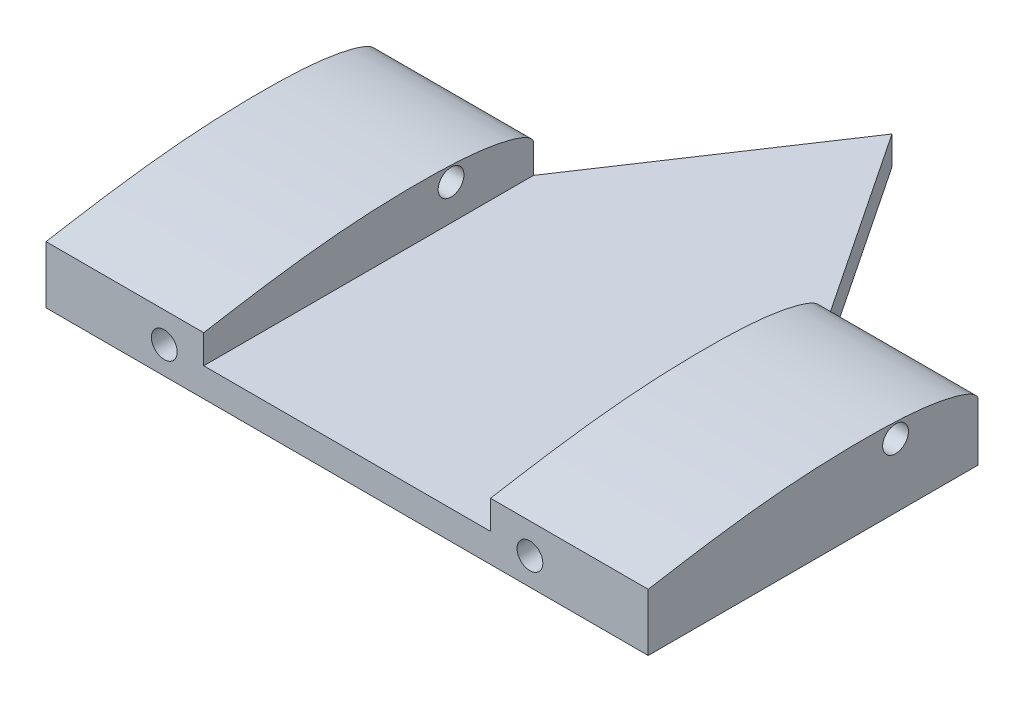
ISO-10303-21;
HEADER;
FILE_DESCRIPTION(('STEP AP214'),'2;1');
FILE_NAME('part.step','',(''),(''),'','','');
FILE_SCHEMA(('AUTOMOTIVE_DESIGN { 1 0 10303 214 1 1 1 1 }'));
ENDSEC;
DATA;
#1=APPLICATION_CONTEXT('core data for automotive mechanical design processes');
#2=APPLICATION_PROTOCOL_DEFINITION('international standard','automotive_design',2000,#1);
#3=PRODUCT_CONTEXT('',#1,'mechanical');
#4=PRODUCT('Part','Part','',(#3));
#5=PRODUCT_RELATED_PRODUCT_CATEGORY('part','',(#4));
#6=PRODUCT_DEFINITION_FORMATION('','',#4);
#7=PRODUCT_DEFINITION_CONTEXT('part definition',#1,'design');
#8=PRODUCT_DEFINITION('design','',#6,#7);
#9=PRODUCT_DEFINITION_SHAPE('','',#8);
#10=(LENGTH_UNIT() NAMED_UNIT(*) SI_UNIT(.MILLI.,.METRE.));
#11=(NAMED_UNIT(*) PLANE_ANGLE_UNIT() SI_UNIT($,.RADIAN.));
#12=(NAMED_UNIT(*) SI_UNIT($,.STERADIAN.) SOLID_ANGLE_UNIT());
#13=UNCERTAINTY_MEASURE_WITH_UNIT(LENGTH_MEASURE(1.E-05),#10,'distance_accuracy_value','');
#14=(GEOMETRIC_REPRESENTATION_CONTEXT(3) GLOBAL_UNCERTAINTY_ASSIGNED_CONTEXT((#13)) GLOBAL_UNIT_ASSIGNED_CONTEXT((#10,
#11,#12)) REPRESENTATION_CONTEXT('',''));
#15=CARTESIAN_POINT('',(0.,0.,0.));
#16=DIRECTION('',(0.,0.,1.));
#17=DIRECTION('',(1.,0.,0.));
#18=AXIS2_PLACEMENT_3D('',#15,#16,#17);
#19=CARTESIAN_POINT('',(0.,10.,-265.));
#20=DIRECTION('',(-0.832050294337844,0.,0.554700196225229));
#21=DIRECTION('',(0.554700196225229,0.,0.832050294337844));
#22=AXIS2_PLACEMENT_3D('',#19,#20,#21);
#23=PLANE('',#22);
#24=DIRECTION('',(0.,-1.,0.));
#25=VECTOR('',#24,1.);
#26=CARTESIAN_POINT('',(100.,10.,-115.));
#27=LINE('',#26,#25);
#28=CARTESIAN_POINT('',(100.,10.,-115.));
#29=VERTEX_POINT('',#28);
#30=CARTESIAN_POINT('',(100.,-10.,-115.));
#31=VERTEX_POINT('',#30);
#32=EDGE_CURVE('E11',#29,#31,#27,.T.);
#33=ORIENTED_EDGE('',*,*,#32,.T.);
#34=DIRECTION('',(0.554700196225229,0.,0.832050294337843));
#35=VECTOR('',#34,1.);
#36=CARTESIAN_POINT('',(100.,-10.,-115.));
#37=LINE('',#36,#35);
#38=CARTESIAN_POINT('',(0.,-10.,-265.));
#39=VERTEX_POINT('',#38);
#40=EDGE_CURVE('E150',#39,#31,#37,.T.);
#41=ORIENTED_EDGE('',*,*,#40,.F.);
#42=DIRECTION('',(0.,-1.,0.));
#43=VECTOR('',#42,1.);
#44=CARTESIAN_POINT('',(0.,10.,-265.));
#45=LINE('',#44,#43);
#46=CARTESIAN_POINT('',(0.,10.,-265.));
#47=VERTEX_POINT('',#46);
#48=EDGE_CURVE('E43',#47,#39,#45,.T.);
#49=ORIENTED_EDGE('',*,*,#48,.F.);
#50=DIRECTION('',(-0.554700196225229,0.,-0.832050294337844));
#51=VECTOR('',#50,1.);
#52=CARTESIAN_POINT('',(0.,10.,-265.));
#53=LINE('',#52,#51);
#54=EDGE_CURVE('E58',#29,#47,#53,.T.);
#55=ORIENTED_EDGE('',*,*,#54,.F.);
#56=EDGE_LOOP('',(#33,#41,#49,#55));
#57=FACE_BOUND('',#56,.T.);
#58=ADVANCED_FACE('F36',(#57),#23,.F.);
#59=CARTESIAN_POINT('',(-100.,10.,-115.));
#60=DIRECTION('',(0.832050294337844,0.,0.554700196225229));
#61=DIRECTION('',(0.554700196225229,0.,-0.832050294337844));
#62=AXIS2_PLACEMENT_3D('',#59,#60,#61);
#63=PLANE('',#62);
#64=ORIENTED_EDGE('',*,*,#48,.T.);
#65=DIRECTION('',(0.55470019622523,0.,-0.832050294337843));
#66=VECTOR('',#65,1.);
#67=CARTESIAN_POINT('',(0.,-10.,-265.));
#68=LINE('',#67,#66);
#69=CARTESIAN_POINT('',(-100.,-10.,-115.));
#70=VERTEX_POINT('',#69);
#71=EDGE_CURVE('E135',#70,#39,#68,.T.);
#72=ORIENTED_EDGE('',*,*,#71,.F.);
#73=DIRECTION('',(0.,-1.,0.));
#74=VECTOR('',#73,1.);
#75=CARTESIAN_POINT('',(-100.,10.,-115.));
#76=LINE('',#75,#74);
#77=CARTESIAN_POINT('',(-100.,10.,-115.));
#78=VERTEX_POINT('',#77);
#79=EDGE_CURVE('E131',#78,#70,#76,.T.);
#80=ORIENTED_EDGE('',*,*,#79,.F.);
#81=DIRECTION('',(-0.554700196225229,0.,0.832050294337844));
#82=VECTOR('',#81,1.);
#83=CARTESIAN_POINT('',(-100.,10.,-115.));
#84=LINE('',#83,#82);
#85=EDGE_CURVE('E239',#47,#78,#84,.T.);
#86=ORIENTED_EDGE('',*,*,#85,.F.);
#87=EDGE_LOOP('',(#64,#72,#80,#86));
#88=FACE_BOUND('',#87,.T.);
#89=ADVANCED_FACE('F248',(#88),#63,.F.);
#90=CARTESIAN_POINT('',(-100.,10.,115.));
#91=DIRECTION('',(0.,0.,-1.));
#92=DIRECTION('',(-1.,0.,0.));
#93=AXIS2_PLACEMENT_3D('',#90,#91,#92);
#94=PLANE('',#93);
#95=CARTESIAN_POINT('',(127.5,9.,115.));
#96=DIRECTION('',(0.,0.,-1.));
#97=DIRECTION('',(-1.,0.,0.));
#98=AXIS2_PLACEMENT_3D('',#95,#96,#97);
#99=CIRCLE('',#98,9.00000000000001);
#100=CARTESIAN_POINT('',(118.5,9.,115.));
#101=VERTEX_POINT('',#100);
#102=EDGE_CURVE('E294',#101,#101,#99,.T.);
#103=ORIENTED_EDGE('',*,*,#102,.T.);
#104=EDGE_LOOP('',(#103));
#105=FACE_BOUND('',#104,.T.);
#106=CARTESIAN_POINT('',(-127.5,9.,115.));
#107=DIRECTION('',(0.,0.,1.));
#108=DIRECTION('',(1.,0.,0.));
#109=AXIS2_PLACEMENT_3D('',#106,#107,#108);
#110=CIRCLE('',#109,9.00000000000001);
#111=CARTESIAN_POINT('',(-118.5,9.,115.));
#112=VERTEX_POINT('',#111);
#113=EDGE_CURVE('E145',#112,#112,#110,.T.);
#114=ORIENTED_EDGE('',*,*,#113,.F.);
#115=EDGE_LOOP('',(#114));
#116=FACE_BOUND('',#115,.T.);
#117=DIRECTION('',(0.,-1.,0.));
#118=VECTOR('',#117,1.);
#119=CARTESIAN_POINT('',(-210.,30.,115.));
#120=LINE('',#119,#118);
#121=CARTESIAN_POINT('',(-210.,30.,115.));
#122=VERTEX_POINT('',#121);
#123=CARTESIAN_POINT('',(-210.,-10.,115.));
#124=VERTEX_POINT('',#123);
#125=EDGE_CURVE('E124',#122,#124,#120,.T.);
#126=ORIENTED_EDGE('',*,*,#125,.T.);
#127=DIRECTION('',(-1.,0.,0.));
#128=VECTOR('',#127,1.);
#129=CARTESIAN_POINT('',(-210.,-10.,115.));
#130=LINE('',#129,#128);
#131=CARTESIAN_POINT('',(210.,-10.,115.));
#132=VERTEX_POINT('',#131);
#133=EDGE_CURVE('E141',#132,#124,#130,.T.);
#134=ORIENTED_EDGE('',*,*,#133,.F.);
#135=DIRECTION('',(0.,-1.,0.));
#136=VECTOR('',#135,1.);
#137=CARTESIAN_POINT('',(210.,30.,115.));
#138=LINE('',#137,#136);
#139=CARTESIAN_POINT('',(210.,30.,115.));
#140=VERTEX_POINT('',#139);
#141=EDGE_CURVE('E223',#140,#132,#138,.T.);
#142=ORIENTED_EDGE('',*,*,#141,.F.);
#143=DIRECTION('',(-1.,0.,0.));
#144=VECTOR('',#143,1.);
#145=CARTESIAN_POINT('',(100.,30.,115.));
#146=LINE('',#145,#144);
#147=CARTESIAN_POINT('',(100.,30.,115.));
#148=VERTEX_POINT('',#147);
#149=EDGE_CURVE('E203',#140,#148,#146,.T.);
#150=ORIENTED_EDGE('',*,*,#149,.T.);
#151=DIRECTION('',(0.,-1.,0.));
#152=VECTOR('',#151,1.);
#153=CARTESIAN_POINT('',(100.,30.,115.));
#154=LINE('',#153,#152);
#155=CARTESIAN_POINT('',(100.,10.,115.));
#156=VERTEX_POINT('',#155);
#157=EDGE_CURVE('E225',#148,#156,#154,.T.);
#158=ORIENTED_EDGE('',*,*,#157,.T.);
#159=DIRECTION('',(1.,0.,0.));
#160=VECTOR('',#159,1.);
#161=CARTESIAN_POINT('',(-100.,10.,115.));
#162=LINE('',#161,#160);
#163=CARTESIAN_POINT('',(-100.,10.,115.));
#164=VERTEX_POINT('',#163);
#165=EDGE_CURVE('E243',#164,#156,#162,.T.);
#166=ORIENTED_EDGE('',*,*,#165,.F.);
#167=DIRECTION('',(0.,-1.,0.));
#168=VECTOR('',#167,1.);
#169=CARTESIAN_POINT('',(-100.,30.,115.));
#170=LINE('',#169,#168);
#171=CARTESIAN_POINT('',(-100.,30.,115.));
#172=VERTEX_POINT('',#171);
#173=EDGE_CURVE('E50',#172,#164,#170,.T.);
#174=ORIENTED_EDGE('',*,*,#173,.F.);
#175=DIRECTION('',(1.,0.,0.));
#176=VECTOR('',#175,1.);
#177=CARTESIAN_POINT('',(-100.,30.,115.));
#178=LINE('',#177,#176);
#179=EDGE_CURVE('E230',#122,#172,#178,.T.);
#180=ORIENTED_EDGE('',*,*,#179,.F.);
#181=EDGE_LOOP('',(#126,#134,#142,#150,#158,#166,#174,#180));
#182=FACE_BOUND('',#181,.T.);
#183=ADVANCED_FACE('F261',(#105,#116,#182),#94,.F.);
#184=CARTESIAN_POINT('',(0.,10.,0.));
#185=DIRECTION('',(0.,1.,0.));
#186=DIRECTION('',(0.,0.,1.));
#187=AXIS2_PLACEMENT_3D('',#184,#185,#186);
#188=PLANE('',#187);
#189=DIRECTION('',(0.,0.,-1.));
#190=VECTOR('',#189,1.);
#191=CARTESIAN_POINT('',(100.,10.,-115.));
#192=LINE('',#191,#190);
#193=EDGE_CURVE('E236',#156,#29,#192,.T.);
#194=ORIENTED_EDGE('',*,*,#193,.T.);
#195=ORIENTED_EDGE('',*,*,#54,.T.);
#196=ORIENTED_EDGE('',*,*,#85,.T.);
#197=DIRECTION('',(0.,0.,1.));
#198=VECTOR('',#197,1.);
#199=CARTESIAN_POINT('',(-100.,10.,-115.));
#200=LINE('',#199,#198);
#201=EDGE_CURVE('E241',#78,#164,#200,.T.);
#202=ORIENTED_EDGE('',*,*,#201,.T.);
#203=ORIENTED_EDGE('',*,*,#165,.T.);
#204=EDGE_LOOP('',(#194,#195,#196,#202,#203));
#205=FACE_BOUND('',#204,.T.);
#206=ADVANCED_FACE('F266',(#205),#188,.T.);
#207=CARTESIAN_POINT('',(-100.,30.,-115.));
#208=DIRECTION('',(-1.,0.,0.));
#209=DIRECTION('',(0.,0.,1.));
#210=AXIS2_PLACEMENT_3D('',#207,#208,#209);
#211=PLANE('',#210);
#212=CARTESIAN_POINT('',(-100.,34.6591642479932,-57.5));
#213=DIRECTION('',(-1.,0.,0.));
#214=DIRECTION('',(0.,0.,1.));
#215=AXIS2_PLACEMENT_3D('',#212,#213,#214);
#216=CIRCLE('',#215,9.);
#217=CARTESIAN_POINT('',(-100.,34.6591642479932,-48.5));
#218=VERTEX_POINT('',#217);
#219=EDGE_CURVE('E168',#218,#218,#216,.T.);
#220=ORIENTED_EDGE('',*,*,#219,.T.);
#221=EDGE_LOOP('',(#220));
#222=FACE_BOUND('',#221,.T.);
#223=DIRECTION('',(0.,-1.,0.));
#224=VECTOR('',#223,1.);
#225=CARTESIAN_POINT('',(-100.,30.,-115.));
#226=LINE('',#225,#224);
#227=CARTESIAN_POINT('',(-100.,30.0000050411301,-114.999999999993));
#228=VERTEX_POINT('',#227);
#229=EDGE_CURVE('E123',#228,#78,#226,.T.);
#230=ORIENTED_EDGE('',*,*,#229,.F.);
#231=CARTESIAN_POINT('',(-100.,30.,115.));
#232=CARTESIAN_POINT('',(-100.,29.992600644719,115.000210544511));
#233=CARTESIAN_POINT('',(-100.,30.1584758641625,113.422148563991));
#234=CARTESIAN_POINT('',(-100.,30.283772029197,111.796644727155));
#235=CARTESIAN_POINT('',(-100.,30.6303383556584,107.814194843398));
#236=CARTESIAN_POINT('',(-100.,30.9873292624649,102.861879622821));
#237=CARTESIAN_POINT('',(-100.,31.376231825754,96.305865405435));
#238=CARTESIAN_POINT('',(-100.,31.6755175866837,88.4893180367523));
#239=CARTESIAN_POINT('',(-100.,31.8077426842266,79.4304945026712));
#240=CARTESIAN_POINT('',(-100.,31.683388701479,69.3413910816794));
#241=CARTESIAN_POINT('',(-100.,31.2745030756222,58.4198501022311));
#242=CARTESIAN_POINT('',(-100.,30.6447969440572,46.8773694769848));
#243=CARTESIAN_POINT('',(-100.,29.8470394342065,34.896947283972));
#244=CARTESIAN_POINT('',(-100.,28.9374050275403,22.6466135348471));
#245=CARTESIAN_POINT('',(-100.,27.9770698966659,10.2824208580842));
#246=CARTESIAN_POINT('',(-100.,27.0298462453761,-2.05398662107581));
#247=CARTESIAN_POINT('',(-100.,26.170492862714,-14.2412429695328));
#248=CARTESIAN_POINT('',(-100.,25.4467077810828,-26.1772298233817));
#249=CARTESIAN_POINT('',(-100.,24.8954967313307,-37.7740423184831));
#250=CARTESIAN_POINT('',(-100.,24.5167683774123,-48.9418740131826));
#251=CARTESIAN_POINT('',(-100.,24.266890816306,-59.5739098519683));
#252=CARTESIAN_POINT('',(-100.,24.1402318322636,-69.5526991053123));
#253=CARTESIAN_POINT('',(-100.,24.1156554211295,-78.7540806024231));
#254=CARTESIAN_POINT('',(-100.,24.2221091480582,-87.0665533774146));
#255=CARTESIAN_POINT('',(-100.,24.4542541964654,-94.3803406066399));
#256=CARTESIAN_POINT('',(-100.,24.8353725962345,-100.623442659174));
#257=CARTESIAN_POINT('',(-100.,25.4502462925107,-105.733457905452));
#258=CARTESIAN_POINT('',(-100.,26.2671650935642,-109.757791111027));
#259=CARTESIAN_POINT('',(-100.,27.3476867181919,-112.584447535259));
#260=CARTESIAN_POINT('',(-100.,28.4094366685377,-114.544522217897));
#261=CARTESIAN_POINT('',(-100.,29.6063915639988,-115.019506308383));
#262=CARTESIAN_POINT('',(-100.,30.7132594924968,-114.971300063155));
#263=CARTESIAN_POINT('',(-100.,32.1052915662163,-114.25248142743));
#264=CARTESIAN_POINT('',(-100.,33.8834681860445,-112.489642477362));
#265=CARTESIAN_POINT('',(-100.,35.6130962398137,-109.692003390892));
#266=CARTESIAN_POINT('',(-100.,37.2651469459092,-105.909966736145));
#267=CARTESIAN_POINT('',(-100.,38.85498467927,-101.131610143887));
#268=CARTESIAN_POINT('',(-100.,40.3665542896124,-95.4058010516471));
#269=CARTESIAN_POINT('',(-100.,41.7511406783988,-88.7833531264978));
#270=CARTESIAN_POINT('',(-100.,42.9563558891461,-81.3220541247461));
#271=CARTESIAN_POINT('',(-100.,43.9335955694006,-73.0737220789578));
#272=CARTESIAN_POINT('',(-100.,44.6715765262238,-64.0946851627725));
#273=CARTESIAN_POINT('',(-100.,45.1627593510516,-54.4497860967675));
#274=CARTESIAN_POINT('',(-100.,45.4375565053147,-44.2241559033097));
#275=CARTESIAN_POINT('',(-100.,45.50524393403,-33.5194371005629));
#276=CARTESIAN_POINT('',(-100.,45.3790176516678,-22.4517850911484));
#277=CARTESIAN_POINT('',(-100.,45.0639400961133,-11.1432868100823));
#278=CARTESIAN_POINT('',(-100.,44.5515483051236,0.285711789981828));
#279=CARTESIAN_POINT('',(-100.,43.8409612115083,11.7233587714626));
#280=CARTESIAN_POINT('',(-100.,42.9281966396428,23.0657244051882));
#281=CARTESIAN_POINT('',(-100.,41.8454401686242,34.2152675159681));
#282=CARTESIAN_POINT('',(-100.,40.6204730074378,45.0692325135158));
#283=CARTESIAN_POINT('',(-100.,39.3028120339416,55.5235476723755));
#284=CARTESIAN_POINT('',(-100.,37.9383429468543,65.4694992054885));
#285=CARTESIAN_POINT('',(-100.,36.5581957322108,74.7959630844861));
#286=CARTESIAN_POINT('',(-100.,35.2705196436502,83.3151663160555));
#287=CARTESIAN_POINT('',(-100.,33.9481658807926,91.0587176966283));
#288=CARTESIAN_POINT('',(-100.,32.9260712653705,97.8541423592512));
#289=CARTESIAN_POINT('',(-100.,31.9302426908917,103.726595064506));
#290=CARTESIAN_POINT('',(-100.,31.1457207177758,108.212226347489));
#291=CARTESIAN_POINT('',(-100.,30.5084209781595,111.912932632528));
#292=CARTESIAN_POINT('',(-100.,30.2264124386437,113.462111319138));
#293=CARTESIAN_POINT('',(-100.,30.0073391701901,114.999791168023));
#294=CARTESIAN_POINT('',(-100.,30.,115.));
#295=B_SPLINE_CURVE_WITH_KNOTS('',3,(#231,#232,#233,#234,#235,#236,#237,#238,#239,#240,#241,
#242,#243,#244,#245,#246,#247,#248,#249,#250,#251,#252,#253,#254,#255,#256,#257,#258,#259,#260,
#261,#262,#263,#264,#265,#266,#267,#268,#269,#270,#271,#272,#273,#274,#275,#276,#277,#278,#279,
#280,#281,#282,#283,#284,#285,#286,#287,#288,#289,#290,#291,#292,#293,#294),.UNSPECIFIED.,.T.,
.F.,(4,1,1,1,1,1,1,1,1,1,1,1,1,1,1,1,1,1,1,1,1,1,1,1,1,1,1,1,1,1,1,1,1,1,1,1,1,1,1,1,1,1,1,1,1,
1,1,1,1,1,1,1,1,1,1,1,1,1,1,1,1,4),(0.,0.00158888881614505,0.0063292178355564,
0.0142024564897436,0.0251728077530559,0.0391734833267743,0.0560606311759249,0.0755789238487883,
0.0973636066296903,0.120926258366677,0.145825281006277,0.171670911815127,0.198108536705041,
0.22479018357162,0.25139057978404,0.277643490654311,0.303326750051388,0.328257458029316,
0.352272548115194,0.375156061746876,0.396620664402003,0.416422729294005,0.434304420097656,
0.450054679859308,0.463465465082325,0.474478994238096,0.483169222153172,0.489678354497499,
0.494104066315722,0.496910015324886,0.497289784891853,0.501214273282496,0.506457950332762,
0.51335695674223,0.522168631834455,0.532965969924531,0.545689209241574,0.56022077890382,
0.57643892310517,0.594258689005965,0.613600244568652,0.634342385932902,0.656331109263004,
0.679351893859712,0.703152302846811,0.727478208080039,0.7520707394079,0.776691163534608,
0.801140183976245,0.825214386971546,0.848697423570622,0.871352857669295,0.892947448931157,
0.913230871058069,0.931955467148994,0.94834206907442,0.963693004275676,0.976235918239566,
0.986320058750392,0.993788799349345,0.998424034933867,1.),.UNSPECIFIED.);
#296=EDGE_CURVE('E171',#228,#172,#295,.T.);
#297=ORIENTED_EDGE('',*,*,#296,.T.);
#298=ORIENTED_EDGE('',*,*,#173,.T.);
#299=ORIENTED_EDGE('',*,*,#201,.F.);
#300=EDGE_LOOP('',(#230,#297,#298,#299));
#301=FACE_BOUND('',#300,.T.);
#302=ADVANCED_FACE('F268',(#222,#301),#211,.F.);
#303=CARTESIAN_POINT('',(-100.,30.,-115.));
#304=DIRECTION('',(0.,0.,1.));
#305=DIRECTION('',(1.,0.,0.));
#306=AXIS2_PLACEMENT_3D('',#303,#304,#305);
#307=PLANE('',#306);
#308=CARTESIAN_POINT('',(-182.5,9.,-115.));
#309=DIRECTION('',(0.,0.,1.));
#310=DIRECTION('',(1.,0.,0.));
#311=AXIS2_PLACEMENT_3D('',#308,#309,#310);
#312=CIRCLE('',#311,9.00000000000001);
#313=CARTESIAN_POINT('',(-173.5,9.,-115.));
#314=VERTEX_POINT('',#313);
#315=EDGE_CURVE('E298',#314,#314,#312,.T.);
#316=ORIENTED_EDGE('',*,*,#315,.T.);
#317=EDGE_LOOP('',(#316));
#318=FACE_BOUND('',#317,.T.);
#319=ORIENTED_EDGE('',*,*,#79,.T.);
#320=DIRECTION('',(1.,0.,0.));
#321=VECTOR('',#320,1.);
#322=CARTESIAN_POINT('',(-100.,-10.,-115.));
#323=LINE('',#322,#321);
#324=CARTESIAN_POINT('',(-210.,-10.,-115.));
#325=VERTEX_POINT('',#324);
#326=EDGE_CURVE('E127',#325,#70,#323,.T.);
#327=ORIENTED_EDGE('',*,*,#326,.F.);
#328=DIRECTION('',(0.,-1.,0.));
#329=VECTOR('',#328,1.);
#330=CARTESIAN_POINT('',(-210.,30.,-115.));
#331=LINE('',#330,#329);
#332=CARTESIAN_POINT('',(-210.,30.,-115.));
#333=VERTEX_POINT('',#332);
#334=EDGE_CURVE('E114',#333,#325,#331,.T.);
#335=ORIENTED_EDGE('',*,*,#334,.F.);
#336=DIRECTION('',(-1.,0.,0.));
#337=VECTOR('',#336,1.);
#338=CARTESIAN_POINT('',(-100.,30.,-115.));
#339=LINE('',#338,#337);
#340=EDGE_CURVE('E228',#228,#333,#339,.T.);
#341=ORIENTED_EDGE('',*,*,#340,.F.);
#342=ORIENTED_EDGE('',*,*,#229,.T.);
#343=EDGE_LOOP('',(#319,#327,#335,#341,#342));
#344=FACE_BOUND('',#343,.T.);
#345=ADVANCED_FACE('F128',(#318,#344),#307,.F.);
#346=CARTESIAN_POINT('',(-210.,30.,-115.));
#347=DIRECTION('',(1.,0.,0.));
#348=DIRECTION('',(0.,0.,-1.));
#349=AXIS2_PLACEMENT_3D('',#346,#347,#348);
#350=PLANE('',#349);
#351=CARTESIAN_POINT('',(-210.,34.6591642479932,-57.5));
#352=DIRECTION('',(1.,0.,0.));
#353=DIRECTION('',(0.,0.,-1.));
#354=AXIS2_PLACEMENT_3D('',#351,#352,#353);
#355=CIRCLE('',#354,9.);
#356=CARTESIAN_POINT('',(-210.,34.6591642479932,-66.5));
#357=VERTEX_POINT('',#356);
#358=EDGE_CURVE('E162',#357,#357,#355,.T.);
#359=ORIENTED_EDGE('',*,*,#358,.T.);
#360=EDGE_LOOP('',(#359));
#361=FACE_BOUND('',#360,.T.);
#362=ORIENTED_EDGE('',*,*,#125,.F.);
#363=CARTESIAN_POINT('',(-210.,30.,115.));
#364=CARTESIAN_POINT('',(-210.,29.992600644719,115.000210544511));
#365=CARTESIAN_POINT('',(-210.,30.1584758641625,113.422148563991));
#366=CARTESIAN_POINT('',(-210.,30.283772029197,111.796644727155));
#367=CARTESIAN_POINT('',(-210.,30.6303383556584,107.814194843398));
#368=CARTESIAN_POINT('',(-210.,30.9873292624649,102.861879622821));
#369=CARTESIAN_POINT('',(-210.,31.376231825754,96.305865405435));
#370=CARTESIAN_POINT('',(-210.,31.6755175866837,88.4893180367523));
#371=CARTESIAN_POINT('',(-210.,31.8077426842266,79.4304945026712));
#372=CARTESIAN_POINT('',(-210.,31.683388701479,69.3413910816794));
#373=CARTESIAN_POINT('',(-210.,31.2745030756222,58.4198501022311));
#374=CARTESIAN_POINT('',(-210.,30.6447969440572,46.8773694769848));
#375=CARTESIAN_POINT('',(-210.,29.8470394342065,34.896947283972));
#376=CARTESIAN_POINT('',(-210.,28.9374050275403,22.6466135348471));
#377=CARTESIAN_POINT('',(-210.,27.9770698966659,10.2824208580842));
#378=CARTESIAN_POINT('',(-210.,27.0298462453761,-2.05398662107581));
#379=CARTESIAN_POINT('',(-210.,26.170492862714,-14.2412429695328));
#380=CARTESIAN_POINT('',(-210.,25.4467077810828,-26.1772298233817));
#381=CARTESIAN_POINT('',(-210.,24.8954967313307,-37.7740423184831));
#382=CARTESIAN_POINT('',(-210.,24.5167683774123,-48.9418740131826));
#383=CARTESIAN_POINT('',(-210.,24.266890816306,-59.5739098519683));
#384=CARTESIAN_POINT('',(-210.,24.1402318322636,-69.5526991053123));
#385=CARTESIAN_POINT('',(-210.,24.1156554211295,-78.7540806024231));
#386=CARTESIAN_POINT('',(-210.,24.2221091480582,-87.0665533774146));
#387=CARTESIAN_POINT('',(-210.,24.4542541964654,-94.3803406066399));
#388=CARTESIAN_POINT('',(-210.,24.8353725962345,-100.623442659174));
#389=CARTESIAN_POINT('',(-210.,25.4502462925107,-105.733457905452));
#390=CARTESIAN_POINT('',(-210.,26.2671650935642,-109.757791111027));
#391=CARTESIAN_POINT('',(-210.,27.3476867181919,-112.584447535259));
#392=CARTESIAN_POINT('',(-210.,28.4094366685377,-114.544522217897));
#393=CARTESIAN_POINT('',(-210.,29.6063915639988,-115.019506308383));
#394=CARTESIAN_POINT('',(-210.,30.7132594924968,-114.971300063155));
#395=CARTESIAN_POINT('',(-210.,32.1052915662163,-114.25248142743));
#396=CARTESIAN_POINT('',(-210.,33.8834681860445,-112.489642477362));
#397=CARTESIAN_POINT('',(-210.,35.6130962398137,-109.692003390892));
#398=CARTESIAN_POINT('',(-210.,37.2651469459092,-105.909966736145));
#399=CARTESIAN_POINT('',(-210.,38.85498467927,-101.131610143887));
#400=CARTESIAN_POINT('',(-210.,40.3665542896124,-95.4058010516471));
#401=CARTESIAN_POINT('',(-210.,41.7511406783988,-88.7833531264978));
#402=CARTESIAN_POINT('',(-210.,42.9563558891461,-81.3220541247461));
#403=CARTESIAN_POINT('',(-210.,43.9335955694006,-73.0737220789578));
#404=CARTESIAN_POINT('',(-210.,44.6715765262238,-64.0946851627725));
#405=CARTESIAN_POINT('',(-210.,45.1627593510516,-54.4497860967675));
#406=CARTESIAN_POINT('',(-210.,45.4375565053147,-44.2241559033097));
#407=CARTESIAN_POINT('',(-210.,45.50524393403,-33.5194371005629));
#408=CARTESIAN_POINT('',(-210.,45.3790176516678,-22.4517850911484));
#409=CARTESIAN_POINT('',(-210.,45.0639400961133,-11.1432868100823));
#410=CARTESIAN_POINT('',(-210.,44.5515483051236,0.285711789981828));
#411=CARTESIAN_POINT('',(-210.,43.8409612115083,11.7233587714626));
#412=CARTESIAN_POINT('',(-210.,42.9281966396428,23.0657244051882));
#413=CARTESIAN_POINT('',(-210.,41.8454401686242,34.2152675159681));
#414=CARTESIAN_POINT('',(-210.,40.6204730074378,45.0692325135158));
#415=CARTESIAN_POINT('',(-210.,39.3028120339416,55.5235476723755));
#416=CARTESIAN_POINT('',(-210.,37.9383429468543,65.4694992054885));
#417=CARTESIAN_POINT('',(-210.,36.5581957322108,74.7959630844861));
#418=CARTESIAN_POINT('',(-210.,35.2705196436502,83.3151663160555));
#419=CARTESIAN_POINT('',(-210.,33.9481658807926,91.0587176966283));
#420=CARTESIAN_POINT('',(-210.,32.9260712653705,97.8541423592512));
#421=CARTESIAN_POINT('',(-210.,31.9302426908917,103.726595064506));
#422=CARTESIAN_POINT('',(-210.,31.1457207177758,108.212226347489));
#423=CARTESIAN_POINT('',(-210.,30.5084209781595,111.912932632528));
#424=CARTESIAN_POINT('',(-210.,30.2264124386437,113.462111319138));
#425=CARTESIAN_POINT('',(-210.,30.0073391701901,114.999791168023));
#426=CARTESIAN_POINT('',(-210.,30.,115.));
#427=B_SPLINE_CURVE_WITH_KNOTS('',3,(#363,#364,#365,#366,#367,#368,#369,#370,#371,#372,#373,
#374,#375,#376,#377,#378,#379,#380,#381,#382,#383,#384,#385,#386,#387,#388,#389,#390,#391,#392,
#393,#394,#395,#396,#397,#398,#399,#400,#401,#402,#403,#404,#405,#406,#407,#408,#409,#410,#411,
#412,#413,#414,#415,#416,#417,#418,#419,#420,#421,#422,#423,#424,#425,#426),.UNSPECIFIED.,.T.,
.F.,(4,1,1,1,1,1,1,1,1,1,1,1,1,1,1,1,1,1,1,1,1,1,1,1,1,1,1,1,1,1,1,1,1,1,1,1,1,1,1,1,1,1,1,1,1,
1,1,1,1,1,1,1,1,1,1,1,1,1,1,1,1,4),(0.,0.00158888881614505,0.0063292178355564,
0.0142024564897436,0.0251728077530559,0.0391734833267743,0.0560606311759249,0.0755789238487883,
0.0973636066296903,0.120926258366677,0.145825281006277,0.171670911815127,0.198108536705041,
0.22479018357162,0.25139057978404,0.277643490654311,0.303326750051388,0.328257458029316,
0.352272548115194,0.375156061746876,0.396620664402003,0.416422729294005,0.434304420097656,
0.450054679859308,0.463465465082325,0.474478994238096,0.483169222153172,0.489678354497499,
0.494104066315722,0.496910015324886,0.497289784891853,0.501214273282496,0.506457950332762,
0.51335695674223,0.522168631834455,0.532965969924531,0.545689209241574,0.56022077890382,
0.57643892310517,0.594258689005965,0.613600244568652,0.634342385932902,0.656331109263004,
0.679351893859712,0.703152302846811,0.727478208080039,0.7520707394079,0.776691163534608,
0.801140183976245,0.825214386971546,0.848697423570622,0.871352857669295,0.892947448931157,
0.913230871058069,0.931955467148994,0.94834206907442,0.963693004275676,0.976235918239566,
0.986320058750392,0.993788799349345,0.998424034933867,1.),.UNSPECIFIED.);
#428=EDGE_CURVE('E120',#333,#122,#427,.T.);
#429=ORIENTED_EDGE('',*,*,#428,.F.);
#430=ORIENTED_EDGE('',*,*,#334,.T.);
#431=DIRECTION('',(0.,0.,-1.));
#432=VECTOR('',#431,1.);
#433=CARTESIAN_POINT('',(-210.,-10.,-115.));
#434=LINE('',#433,#432);
#435=EDGE_CURVE('E119',#124,#325,#434,.T.);
#436=ORIENTED_EDGE('',*,*,#435,.F.);
#437=EDGE_LOOP('',(#362,#429,#430,#436));
#438=FACE_BOUND('',#437,.T.);
#439=ADVANCED_FACE('F117',(#361,#438),#350,.F.);
#440=CARTESIAN_POINT('',(100.,30.,-115.));
#441=DIRECTION('',(-1.,0.,0.));
#442=DIRECTION('',(0.,0.,1.));
#443=AXIS2_PLACEMENT_3D('',#440,#441,#442);
#444=PLANE('',#443);
#445=CARTESIAN_POINT('',(100.,34.6591642479932,-57.5));
#446=DIRECTION('',(-1.,0.,0.));
#447=DIRECTION('',(0.,0.,1.));
#448=AXIS2_PLACEMENT_3D('',#445,#446,#447);
#449=CIRCLE('',#448,9.);
#450=CARTESIAN_POINT('',(100.,34.6591642479932,-48.5));
#451=VERTEX_POINT('',#450);
#452=EDGE_CURVE('E165',#451,#451,#449,.T.);
#453=ORIENTED_EDGE('',*,*,#452,.F.);
#454=EDGE_LOOP('',(#453));
#455=FACE_BOUND('',#454,.T.);
#456=CARTESIAN_POINT('',(100.,30.,115.));
#457=CARTESIAN_POINT('',(100.,29.992600644719,115.000210544511));
#458=CARTESIAN_POINT('',(100.,30.1584758641625,113.422148563991));
#459=CARTESIAN_POINT('',(100.,30.283772029197,111.796644727155));
#460=CARTESIAN_POINT('',(100.,30.6303383556584,107.814194843398));
#461=CARTESIAN_POINT('',(100.,30.9873292624649,102.861879622821));
#462=CARTESIAN_POINT('',(100.,31.376231825754,96.305865405435));
#463=CARTESIAN_POINT('',(100.,31.6755175866837,88.4893180367523));
#464=CARTESIAN_POINT('',(100.,31.8077426842266,79.4304945026712));
#465=CARTESIAN_POINT('',(100.,31.683388701479,69.3413910816794));
#466=CARTESIAN_POINT('',(100.,31.2745030756222,58.4198501022311));
#467=CARTESIAN_POINT('',(100.,30.6447969440572,46.8773694769848));
#468=CARTESIAN_POINT('',(100.,29.8470394342065,34.896947283972));
#469=CARTESIAN_POINT('',(100.,28.9374050275403,22.6466135348471));
#470=CARTESIAN_POINT('',(100.,27.9770698966659,10.2824208580842));
#471=CARTESIAN_POINT('',(100.,27.0298462453761,-2.05398662107581));
#472=CARTESIAN_POINT('',(100.,26.170492862714,-14.2412429695328));
#473=CARTESIAN_POINT('',(100.,25.4467077810828,-26.1772298233817));
#474=CARTESIAN_POINT('',(100.,24.8954967313307,-37.7740423184831));
#475=CARTESIAN_POINT('',(100.,24.5167683774123,-48.9418740131826));
#476=CARTESIAN_POINT('',(100.,24.266890816306,-59.5739098519683));
#477=CARTESIAN_POINT('',(100.,24.1402318322636,-69.5526991053123));
#478=CARTESIAN_POINT('',(100.,24.1156554211295,-78.7540806024231));
#479=CARTESIAN_POINT('',(100.,24.2221091480582,-87.0665533774146));
#480=CARTESIAN_POINT('',(100.,24.4542541964654,-94.3803406066399));
#481=CARTESIAN_POINT('',(100.,24.8353725962345,-100.623442659174));
#482=CARTESIAN_POINT('',(100.,25.4502462925107,-105.733457905452));
#483=CARTESIAN_POINT('',(100.,26.2671650935642,-109.757791111027));
#484=CARTESIAN_POINT('',(100.,27.3476867181919,-112.584447535259));
#485=CARTESIAN_POINT('',(100.,28.4094366685377,-114.544522217897));
#486=CARTESIAN_POINT('',(100.,29.6063915639988,-115.019506308383));
#487=CARTESIAN_POINT('',(100.,30.7132594924968,-114.971300063155));
#488=CARTESIAN_POINT('',(100.,32.1052915662163,-114.25248142743));
#489=CARTESIAN_POINT('',(100.,33.8834681860445,-112.489642477362));
#490=CARTESIAN_POINT('',(100.,35.6130962398137,-109.692003390892));
#491=CARTESIAN_POINT('',(100.,37.2651469459092,-105.909966736145));
#492=CARTESIAN_POINT('',(100.,38.85498467927,-101.131610143887));
#493=CARTESIAN_POINT('',(100.,40.3665542896124,-95.4058010516471));
#494=CARTESIAN_POINT('',(100.,41.7511406783988,-88.7833531264978));
#495=CARTESIAN_POINT('',(100.,42.9563558891461,-81.3220541247461));
#496=CARTESIAN_POINT('',(100.,43.9335955694006,-73.0737220789578));
#497=CARTESIAN_POINT('',(100.,44.6715765262238,-64.0946851627725));
#498=CARTESIAN_POINT('',(100.,45.1627593510516,-54.4497860967675));
#499=CARTESIAN_POINT('',(100.,45.4375565053147,-44.2241559033097));
#500=CARTESIAN_POINT('',(100.,45.50524393403,-33.5194371005629));
#501=CARTESIAN_POINT('',(100.,45.3790176516678,-22.4517850911484));
#502=CARTESIAN_POINT('',(100.,45.0639400961133,-11.1432868100823));
#503=CARTESIAN_POINT('',(100.,44.5515483051236,0.285711789981828));
#504=CARTESIAN_POINT('',(100.,43.8409612115083,11.7233587714626));
#505=CARTESIAN_POINT('',(100.,42.9281966396428,23.0657244051882));
#506=CARTESIAN_POINT('',(100.,41.8454401686242,34.2152675159681));
#507=CARTESIAN_POINT('',(100.,40.6204730074378,45.0692325135158));
#508=CARTESIAN_POINT('',(100.,39.3028120339416,55.5235476723755));
#509=CARTESIAN_POINT('',(100.,37.9383429468543,65.4694992054885));
#510=CARTESIAN_POINT('',(100.,36.5581957322108,74.7959630844861));
#511=CARTESIAN_POINT('',(100.,35.2705196436502,83.3151663160555));
#512=CARTESIAN_POINT('',(100.,33.9481658807926,91.0587176966283));
#513=CARTESIAN_POINT('',(100.,32.9260712653705,97.8541423592512));
#514=CARTESIAN_POINT('',(100.,31.9302426908917,103.726595064506));
#515=CARTESIAN_POINT('',(100.,31.1457207177758,108.212226347489));
#516=CARTESIAN_POINT('',(100.,30.5084209781595,111.912932632528));
#517=CARTESIAN_POINT('',(100.,30.2264124386437,113.462111319138));
#518=CARTESIAN_POINT('',(100.,30.0073391701901,114.999791168023));
#519=CARTESIAN_POINT('',(100.,30.,115.));
#520=B_SPLINE_CURVE_WITH_KNOTS('',3,(#456,#457,#458,#459,#460,#461,#462,#463,#464,#465,#466,
#467,#468,#469,#470,#471,#472,#473,#474,#475,#476,#477,#478,#479,#480,#481,#482,#483,#484,#485,
#486,#487,#488,#489,#490,#491,#492,#493,#494,#495,#496,#497,#498,#499,#500,#501,#502,#503,#504,
#505,#506,#507,#508,#509,#510,#511,#512,#513,#514,#515,#516,#517,#518,#519),.UNSPECIFIED.,.T.,
.F.,(4,1,1,1,1,1,1,1,1,1,1,1,1,1,1,1,1,1,1,1,1,1,1,1,1,1,1,1,1,1,1,1,1,1,1,1,1,1,1,1,1,1,1,1,1,
1,1,1,1,1,1,1,1,1,1,1,1,1,1,1,1,4),(0.,0.00158888881614505,0.0063292178355564,
0.0142024564897436,0.0251728077530559,0.0391734833267743,0.0560606311759249,0.0755789238487883,
0.0973636066296903,0.120926258366677,0.145825281006277,0.171670911815127,0.198108536705041,
0.22479018357162,0.25139057978404,0.277643490654311,0.303326750051388,0.328257458029316,
0.352272548115194,0.375156061746876,0.396620664402003,0.416422729294005,0.434304420097656,
0.450054679859308,0.463465465082325,0.474478994238096,0.483169222153172,0.489678354497499,
0.494104066315722,0.496910015324886,0.497289784891853,0.501214273282496,0.506457950332762,
0.51335695674223,0.522168631834455,0.532965969924531,0.545689209241574,0.56022077890382,
0.57643892310517,0.594258689005965,0.613600244568652,0.634342385932902,0.656331109263004,
0.679351893859712,0.703152302846811,0.727478208080039,0.7520707394079,0.776691163534608,
0.801140183976245,0.825214386971546,0.848697423570622,0.871352857669295,0.892947448931157,
0.913230871058069,0.931955467148994,0.94834206907442,0.963693004275676,0.976235918239566,
0.986320058750392,0.993788799349345,0.998424034933867,1.),.UNSPECIFIED.);
#521=CARTESIAN_POINT('',(100.,30.,-115.));
#522=VERTEX_POINT('',#521);
#523=EDGE_CURVE('E176',#522,#148,#520,.T.);
#524=ORIENTED_EDGE('',*,*,#523,.F.);
#525=DIRECTION('',(0.,-1.,0.));
#526=VECTOR('',#525,1.);
#527=CARTESIAN_POINT('',(100.,30.,-115.));
#528=LINE('',#527,#526);
#529=EDGE_CURVE('E219',#522,#29,#528,.T.);
#530=ORIENTED_EDGE('',*,*,#529,.T.);
#531=ORIENTED_EDGE('',*,*,#193,.F.);
#532=ORIENTED_EDGE('',*,*,#157,.F.);
#533=EDGE_LOOP('',(#524,#530,#531,#532));
#534=FACE_BOUND('',#533,.T.);
#535=ADVANCED_FACE('F264',(#455,#534),#444,.T.);
#536=CARTESIAN_POINT('',(210.,30.,-115.));
#537=DIRECTION('',(1.,0.,0.));
#538=DIRECTION('',(0.,0.,-1.));
#539=AXIS2_PLACEMENT_3D('',#536,#537,#538);
#540=PLANE('',#539);
#541=CARTESIAN_POINT('',(210.,34.6591642479932,-57.5));
#542=DIRECTION('',(1.,0.,0.));
#543=DIRECTION('',(0.,0.,-1.));
#544=AXIS2_PLACEMENT_3D('',#541,#542,#543);
#545=CIRCLE('',#544,9.);
#546=CARTESIAN_POINT('',(210.,34.6591642479932,-66.5));
#547=VERTEX_POINT('',#546);
#548=EDGE_CURVE('E159',#547,#547,#545,.T.);
#549=ORIENTED_EDGE('',*,*,#548,.F.);
#550=EDGE_LOOP('',(#549));
#551=FACE_BOUND('',#550,.T.);
#552=CARTESIAN_POINT('',(210.,30.,115.));
#553=CARTESIAN_POINT('',(210.,29.992600644719,115.000210544511));
#554=CARTESIAN_POINT('',(210.,30.1584758641625,113.422148563991));
#555=CARTESIAN_POINT('',(210.,30.283772029197,111.796644727155));
#556=CARTESIAN_POINT('',(210.,30.6303383556584,107.814194843398));
#557=CARTESIAN_POINT('',(210.,30.9873292624649,102.861879622821));
#558=CARTESIAN_POINT('',(210.,31.376231825754,96.305865405435));
#559=CARTESIAN_POINT('',(210.,31.6755175866837,88.4893180367523));
#560=CARTESIAN_POINT('',(210.,31.8077426842266,79.4304945026712));
#561=CARTESIAN_POINT('',(210.,31.683388701479,69.3413910816794));
#562=CARTESIAN_POINT('',(210.,31.2745030756222,58.4198501022311));
#563=CARTESIAN_POINT('',(210.,30.6447969440572,46.8773694769848));
#564=CARTESIAN_POINT('',(210.,29.8470394342065,34.896947283972));
#565=CARTESIAN_POINT('',(210.,28.9374050275403,22.6466135348471));
#566=CARTESIAN_POINT('',(210.,27.9770698966659,10.2824208580842));
#567=CARTESIAN_POINT('',(210.,27.0298462453761,-2.05398662107581));
#568=CARTESIAN_POINT('',(210.,26.170492862714,-14.2412429695328));
#569=CARTESIAN_POINT('',(210.,25.4467077810828,-26.1772298233817));
#570=CARTESIAN_POINT('',(210.,24.8954967313307,-37.7740423184831));
#571=CARTESIAN_POINT('',(210.,24.5167683774123,-48.9418740131826));
#572=CARTESIAN_POINT('',(210.,24.266890816306,-59.5739098519683));
#573=CARTESIAN_POINT('',(210.,24.1402318322636,-69.5526991053123));
#574=CARTESIAN_POINT('',(210.,24.1156554211295,-78.7540806024231));
#575=CARTESIAN_POINT('',(210.,24.2221091480582,-87.0665533774146));
#576=CARTESIAN_POINT('',(210.,24.4542541964654,-94.3803406066399));
#577=CARTESIAN_POINT('',(210.,24.8353725962345,-100.623442659174));
#578=CARTESIAN_POINT('',(210.,25.4502462925107,-105.733457905452));
#579=CARTESIAN_POINT('',(210.,26.2671650935642,-109.757791111027));
#580=CARTESIAN_POINT('',(210.,27.3476867181919,-112.584447535259));
#581=CARTESIAN_POINT('',(210.,28.4094366685377,-114.544522217897));
#582=CARTESIAN_POINT('',(210.,29.6063915639988,-115.019506308383));
#583=CARTESIAN_POINT('',(210.,30.7132594924968,-114.971300063155));
#584=CARTESIAN_POINT('',(210.,32.1052915662163,-114.25248142743));
#585=CARTESIAN_POINT('',(210.,33.8834681860445,-112.489642477362));
#586=CARTESIAN_POINT('',(210.,35.6130962398137,-109.692003390892));
#587=CARTESIAN_POINT('',(210.,37.2651469459092,-105.909966736145));
#588=CARTESIAN_POINT('',(210.,38.85498467927,-101.131610143887));
#589=CARTESIAN_POINT('',(210.,40.3665542896124,-95.4058010516471));
#590=CARTESIAN_POINT('',(210.,41.7511406783988,-88.7833531264978));
#591=CARTESIAN_POINT('',(210.,42.9563558891461,-81.3220541247461));
#592=CARTESIAN_POINT('',(210.,43.9335955694006,-73.0737220789578));
#593=CARTESIAN_POINT('',(210.,44.6715765262238,-64.0946851627725));
#594=CARTESIAN_POINT('',(210.,45.1627593510516,-54.4497860967675));
#595=CARTESIAN_POINT('',(210.,45.4375565053147,-44.2241559033097));
#596=CARTESIAN_POINT('',(210.,45.50524393403,-33.5194371005629));
#597=CARTESIAN_POINT('',(210.,45.3790176516678,-22.4517850911484));
#598=CARTESIAN_POINT('',(210.,45.0639400961133,-11.1432868100823));
#599=CARTESIAN_POINT('',(210.,44.5515483051236,0.285711789981828));
#600=CARTESIAN_POINT('',(210.,43.8409612115083,11.7233587714626));
#601=CARTESIAN_POINT('',(210.,42.9281966396428,23.0657244051882));
#602=CARTESIAN_POINT('',(210.,41.8454401686242,34.2152675159681));
#603=CARTESIAN_POINT('',(210.,40.6204730074378,45.0692325135158));
#604=CARTESIAN_POINT('',(210.,39.3028120339416,55.5235476723755));
#605=CARTESIAN_POINT('',(210.,37.9383429468543,65.4694992054885));
#606=CARTESIAN_POINT('',(210.,36.5581957322108,74.7959630844861));
#607=CARTESIAN_POINT('',(210.,35.2705196436502,83.3151663160555));
#608=CARTESIAN_POINT('',(210.,33.9481658807926,91.0587176966283));
#609=CARTESIAN_POINT('',(210.,32.9260712653705,97.8541423592512));
#610=CARTESIAN_POINT('',(210.,31.9302426908917,103.726595064506));
#611=CARTESIAN_POINT('',(210.,31.1457207177758,108.212226347489));
#612=CARTESIAN_POINT('',(210.,30.5084209781595,111.912932632528));
#613=CARTESIAN_POINT('',(210.,30.2264124386437,113.462111319138));
#614=CARTESIAN_POINT('',(210.,30.0073391701901,114.999791168023));
#615=CARTESIAN_POINT('',(210.,30.,115.));
#616=B_SPLINE_CURVE_WITH_KNOTS('',3,(#552,#553,#554,#555,#556,#557,#558,#559,#560,#561,#562,
#563,#564,#565,#566,#567,#568,#569,#570,#571,#572,#573,#574,#575,#576,#577,#578,#579,#580,#581,
#582,#583,#584,#585,#586,#587,#588,#589,#590,#591,#592,#593,#594,#595,#596,#597,#598,#599,#600,
#601,#602,#603,#604,#605,#606,#607,#608,#609,#610,#611,#612,#613,#614,#615),.UNSPECIFIED.,.T.,
.F.,(4,1,1,1,1,1,1,1,1,1,1,1,1,1,1,1,1,1,1,1,1,1,1,1,1,1,1,1,1,1,1,1,1,1,1,1,1,1,1,1,1,1,1,1,1,
1,1,1,1,1,1,1,1,1,1,1,1,1,1,1,1,4),(0.,0.00158888881614505,0.0063292178355564,
0.0142024564897436,0.0251728077530559,0.0391734833267743,0.0560606311759249,0.0755789238487883,
0.0973636066296903,0.120926258366677,0.145825281006277,0.171670911815127,0.198108536705041,
0.22479018357162,0.25139057978404,0.277643490654311,0.303326750051388,0.328257458029316,
0.352272548115194,0.375156061746876,0.396620664402003,0.416422729294005,0.434304420097656,
0.450054679859308,0.463465465082325,0.474478994238096,0.483169222153172,0.489678354497499,
0.494104066315722,0.496910015324886,0.497289784891853,0.501214273282496,0.506457950332762,
0.51335695674223,0.522168631834455,0.532965969924531,0.545689209241574,0.56022077890382,
0.57643892310517,0.594258689005965,0.613600244568652,0.634342385932902,0.656331109263004,
0.679351893859712,0.703152302846811,0.727478208080039,0.7520707394079,0.776691163534608,
0.801140183976245,0.825214386971546,0.848697423570622,0.871352857669295,0.892947448931157,
0.913230871058069,0.931955467148994,0.94834206907442,0.963693004275676,0.976235918239566,
0.986320058750392,0.993788799349345,0.998424034933867,1.),.UNSPECIFIED.);
#617=CARTESIAN_POINT('',(210.,30.,-115.));
#618=VERTEX_POINT('',#617);
#619=EDGE_CURVE('E197',#618,#140,#616,.T.);
#620=ORIENTED_EDGE('',*,*,#619,.T.);
#621=ORIENTED_EDGE('',*,*,#141,.T.);
#622=DIRECTION('',(0.,0.,1.));
#623=VECTOR('',#622,1.);
#624=CARTESIAN_POINT('',(210.,-10.,115.));
#625=LINE('',#624,#623);
#626=CARTESIAN_POINT('',(210.,-10.,-115.));
#627=VERTEX_POINT('',#626);
#628=EDGE_CURVE('E156',#627,#132,#625,.T.);
#629=ORIENTED_EDGE('',*,*,#628,.F.);
#630=DIRECTION('',(0.,-1.,0.));
#631=VECTOR('',#630,1.);
#632=CARTESIAN_POINT('',(210.,30.,-115.));
#633=LINE('',#632,#631);
#634=EDGE_CURVE('E221',#618,#627,#633,.T.);
#635=ORIENTED_EDGE('',*,*,#634,.F.);
#636=EDGE_LOOP('',(#620,#621,#629,#635));
#637=FACE_BOUND('',#636,.T.);
#638=ADVANCED_FACE('F257',(#551,#637),#540,.T.);
#639=CARTESIAN_POINT('',(100.,30.,-115.));
#640=DIRECTION('',(0.,0.,-1.));
#641=DIRECTION('',(-1.,0.,0.));
#642=AXIS2_PLACEMENT_3D('',#639,#640,#641);
#643=PLANE('',#642);
#644=CARTESIAN_POINT('',(182.5,9.,-115.));
#645=DIRECTION('',(0.,0.,-1.));
#646=DIRECTION('',(-1.,0.,0.));
#647=AXIS2_PLACEMENT_3D('',#644,#645,#646);
#648=CIRCLE('',#647,9.00000000000001);
#649=CARTESIAN_POINT('',(173.5,9.,-115.));
#650=VERTEX_POINT('',#649);
#651=EDGE_CURVE('E308',#650,#650,#648,.T.);
#652=ORIENTED_EDGE('',*,*,#651,.F.);
#653=EDGE_LOOP('',(#652));
#654=FACE_BOUND('',#653,.T.);
#655=ORIENTED_EDGE('',*,*,#634,.T.);
#656=DIRECTION('',(1.,0.,0.));
#657=VECTOR('',#656,1.);
#658=CARTESIAN_POINT('',(210.,-10.,-115.));
#659=LINE('',#658,#657);
#660=EDGE_CURVE('E153',#31,#627,#659,.T.);
#661=ORIENTED_EDGE('',*,*,#660,.F.);
#662=ORIENTED_EDGE('',*,*,#32,.F.);
#663=ORIENTED_EDGE('',*,*,#529,.F.);
#664=DIRECTION('',(1.,0.,0.));
#665=VECTOR('',#664,1.);
#666=CARTESIAN_POINT('',(100.,30.,-115.));
#667=LINE('',#666,#665);
#668=EDGE_CURVE('E216',#522,#618,#667,.T.);
#669=ORIENTED_EDGE('',*,*,#668,.T.);
#670=EDGE_LOOP('',(#655,#661,#662,#663,#669));
#671=FACE_BOUND('',#670,.T.);
#672=ADVANCED_FACE('F194',(#654,#671),#643,.T.);
#673=DIRECTION('',(-1.,0.,0.));
#674=VECTOR('',#673,1.);
#675=SURFACE_OF_LINEAR_EXTRUSION('',#616,#674);
#676=ORIENTED_EDGE('',*,*,#619,.F.);
#677=ORIENTED_EDGE('',*,*,#668,.F.);
#678=ORIENTED_EDGE('',*,*,#523,.T.);
#679=ORIENTED_EDGE('',*,*,#149,.F.);
#680=EDGE_LOOP('',(#676,#677,#678,#679));
#681=FACE_BOUND('',#680,.T.);
#682=ADVANCED_FACE('F189',(#681),#675,.F.);
#683=DIRECTION('',(1.,0.,0.));
#684=VECTOR('',#683,1.);
#685=SURFACE_OF_LINEAR_EXTRUSION('',#427,#684);
#686=ORIENTED_EDGE('',*,*,#340,.T.);
#687=ORIENTED_EDGE('',*,*,#428,.T.);
#688=ORIENTED_EDGE('',*,*,#179,.T.);
#689=ORIENTED_EDGE('',*,*,#296,.F.);
#690=EDGE_LOOP('',(#686,#687,#688,#689));
#691=FACE_BOUND('',#690,.T.);
#692=ADVANCED_FACE('F184',(#691),#685,.T.);
#693=CARTESIAN_POINT('',(-210.,34.6591642479932,-57.5));
#694=DIRECTION('',(1.,0.,0.));
#695=DIRECTION('',(0.,0.,-1.));
#696=AXIS2_PLACEMENT_3D('',#693,#694,#695);
#697=CYLINDRICAL_SURFACE('',#696,9.);
#698=ORIENTED_EDGE('',*,*,#452,.T.);
#699=EDGE_LOOP('',(#698));
#700=FACE_BOUND('',#699,.T.);
#701=ORIENTED_EDGE('',*,*,#548,.T.);
#702=EDGE_LOOP('',(#701));
#703=FACE_BOUND('',#702,.T.);
#704=ADVANCED_FACE('F188',(#700,#703),#697,.F.);
#705=ORIENTED_EDGE('',*,*,#358,.F.);
#706=EDGE_LOOP('',(#705));
#707=FACE_BOUND('',#706,.T.);
#708=ORIENTED_EDGE('',*,*,#219,.F.);
#709=EDGE_LOOP('',(#708));
#710=FACE_BOUND('',#709,.T.);
#711=ADVANCED_FACE('F338',(#707,#710),#697,.F.);
#712=CARTESIAN_POINT('',(0.,-10.,0.));
#713=DIRECTION('',(0.,1.,0.));
#714=DIRECTION('',(0.,0.,1.));
#715=AXIS2_PLACEMENT_3D('',#712,#713,#714);
#716=PLANE('',#715);
#717=ORIENTED_EDGE('',*,*,#435,.T.);
#718=ORIENTED_EDGE('',*,*,#326,.T.);
#719=ORIENTED_EDGE('',*,*,#71,.T.);
#720=ORIENTED_EDGE('',*,*,#40,.T.);
#721=ORIENTED_EDGE('',*,*,#660,.T.);
#722=ORIENTED_EDGE('',*,*,#628,.T.);
#723=ORIENTED_EDGE('',*,*,#133,.T.);
#724=EDGE_LOOP('',(#717,#718,#719,#720,#721,#722,#723));
#725=FACE_BOUND('',#724,.T.);
#726=ADVANCED_FACE('F138',(#725),#716,.F.);
#727=CARTESIAN_POINT('',(-127.5,9.,-95.));
#728=DIRECTION('',(0.,0.,1.));
#729=DIRECTION('',(1.,0.,0.));
#730=AXIS2_PLACEMENT_3D('',#727,#728,#729);
#731=CYLINDRICAL_SURFACE('',#730,9.00000000000001);
#732=CARTESIAN_POINT('',(-127.5,9.,-95.));
#733=DIRECTION('',(0.,0.,1.));
#734=DIRECTION('',(1.,0.,0.));
#735=AXIS2_PLACEMENT_3D('',#732,#733,#734);
#736=CIRCLE('',#735,9.00000000000001);
#737=CARTESIAN_POINT('',(-118.5,9.,-95.));
#738=VERTEX_POINT('',#737);
#739=EDGE_CURVE('E142',#738,#738,#736,.T.);
#740=ORIENTED_EDGE('',*,*,#739,.F.);
#741=EDGE_LOOP('',(#740));
#742=FACE_BOUND('',#741,.T.);
#743=ORIENTED_EDGE('',*,*,#113,.T.);
#744=EDGE_LOOP('',(#743));
#745=FACE_BOUND('',#744,.T.);
#746=ADVANCED_FACE('F346',(#742,#745),#731,.F.);
#747=CARTESIAN_POINT('',(-127.5,9.,-95.));
#748=DIRECTION('',(0.,0.,1.));
#749=DIRECTION('',(1.,0.,0.));
#750=AXIS2_PLACEMENT_3D('',#747,#748,#749);
#751=PLANE('',#750);
#752=ORIENTED_EDGE('',*,*,#739,.T.);
#753=EDGE_LOOP('',(#752));
#754=FACE_BOUND('',#753,.T.);
#755=ADVANCED_FACE('F450',(#754),#751,.T.);
#756=CARTESIAN_POINT('',(-182.5,9.,-115.));
#757=DIRECTION('',(0.,0.,1.));
#758=DIRECTION('',(1.,0.,0.));
#759=AXIS2_PLACEMENT_3D('',#756,#757,#758);
#760=CYLINDRICAL_SURFACE('',#759,9.00000000000001);
#761=ORIENTED_EDGE('',*,*,#315,.F.);
#762=EDGE_LOOP('',(#761));
#763=FACE_BOUND('',#762,.T.);
#764=CARTESIAN_POINT('',(-182.5,9.,95.));
#765=DIRECTION('',(0.,0.,1.));
#766=DIRECTION('',(1.,0.,0.));
#767=AXIS2_PLACEMENT_3D('',#764,#765,#766);
#768=CIRCLE('',#767,9.00000000000001);
#769=CARTESIAN_POINT('',(-173.5,9.,95.));
#770=VERTEX_POINT('',#769);
#771=EDGE_CURVE('E300',#770,#770,#768,.T.);
#772=ORIENTED_EDGE('',*,*,#771,.T.);
#773=EDGE_LOOP('',(#772));
#774=FACE_BOUND('',#773,.T.);
#775=ADVANCED_FACE('F459',(#763,#774),#760,.F.);
#776=CARTESIAN_POINT('',(-182.5,9.,95.));
#777=DIRECTION('',(0.,0.,1.));
#778=DIRECTION('',(1.,0.,0.));
#779=AXIS2_PLACEMENT_3D('',#776,#777,#778);
#780=PLANE('',#779);
#781=ORIENTED_EDGE('',*,*,#771,.F.);
#782=EDGE_LOOP('',(#781));
#783=FACE_BOUND('',#782,.T.);
#784=ADVANCED_FACE('F468',(#783),#780,.F.);
#785=CARTESIAN_POINT('',(127.5,9.,-95.));
#786=DIRECTION('',(0.,0.,1.));
#787=DIRECTION('',(1.,0.,0.));
#788=AXIS2_PLACEMENT_3D('',#785,#786,#787);
#789=CYLINDRICAL_SURFACE('',#788,9.00000000000001);
#790=CARTESIAN_POINT('',(127.5,9.,-95.));
#791=DIRECTION('',(0.,0.,-1.));
#792=DIRECTION('',(-1.,0.,0.));
#793=AXIS2_PLACEMENT_3D('',#790,#791,#792);
#794=CIRCLE('',#793,9.00000000000001);
#795=CARTESIAN_POINT('',(118.5,9.,-95.));
#796=VERTEX_POINT('',#795);
#797=EDGE_CURVE('E304',#796,#796,#794,.T.);
#798=ORIENTED_EDGE('',*,*,#797,.T.);
#799=EDGE_LOOP('',(#798));
#800=FACE_BOUND('',#799,.T.);
#801=ORIENTED_EDGE('',*,*,#102,.F.);
#802=EDGE_LOOP('',(#801));
#803=FACE_BOUND('',#802,.T.);
#804=ADVANCED_FACE('F477',(#800,#803),#789,.F.);
#805=CARTESIAN_POINT('',(127.5,9.,-95.));
#806=DIRECTION('',(0.,0.,1.));
#807=DIRECTION('',(-1.,0.,0.));
#808=AXIS2_PLACEMENT_3D('',#805,#806,#807);
#809=PLANE('',#808);
#810=ORIENTED_EDGE('',*,*,#797,.F.);
#811=EDGE_LOOP('',(#810));
#812=FACE_BOUND('',#811,.T.);
#813=ADVANCED_FACE('F485',(#812),#809,.T.);
#814=CARTESIAN_POINT('',(182.5,9.,-115.));
#815=DIRECTION('',(0.,0.,1.));
#816=DIRECTION('',(1.,0.,0.));
#817=AXIS2_PLACEMENT_3D('',#814,#815,#816);
#818=CYLINDRICAL_SURFACE('',#817,9.00000000000001);
#819=ORIENTED_EDGE('',*,*,#651,.T.);
#820=EDGE_LOOP('',(#819));
#821=FACE_BOUND('',#820,.T.);
#822=CARTESIAN_POINT('',(182.5,9.,95.));
#823=DIRECTION('',(0.,0.,-1.));
#824=DIRECTION('',(-1.,0.,0.));
#825=AXIS2_PLACEMENT_3D('',#822,#823,#824);
#826=CIRCLE('',#825,9.00000000000001);
#827=CARTESIAN_POINT('',(173.5,9.,95.));
#828=VERTEX_POINT('',#827);
#829=EDGE_CURVE('E311',#828,#828,#826,.T.);
#830=ORIENTED_EDGE('',*,*,#829,.F.);
#831=EDGE_LOOP('',(#830));
#832=FACE_BOUND('',#831,.T.);
#833=ADVANCED_FACE('F317',(#821,#832),#818,.F.);
#834=CARTESIAN_POINT('',(182.5,9.,95.));
#835=DIRECTION('',(0.,0.,1.));
#836=DIRECTION('',(-1.,0.,0.));
#837=AXIS2_PLACEMENT_3D('',#834,#835,#836);
#838=PLANE('',#837);
#839=ORIENTED_EDGE('',*,*,#829,.T.);
#840=EDGE_LOOP('',(#839));
#841=FACE_BOUND('',#840,.T.);
#842=ADVANCED_FACE('F502',(#841),#838,.F.);
#843=CLOSED_SHELL('',(#58,#89,#183,#206,#302,#345,#439,#535,#638,#672,#682,#692,#704,#711,#726,
#746,#755,#775,#784,#804,#813,#833,#842));
#844=MANIFOLD_SOLID_BREP('B2',#843);
#845=ADVANCED_BREP_SHAPE_REPRESENTATION('',(#18,#844),#14);
#846=SHAPE_DEFINITION_REPRESENTATION(#9,#845);
ENDSEC;
END-ISO-10303-21;
